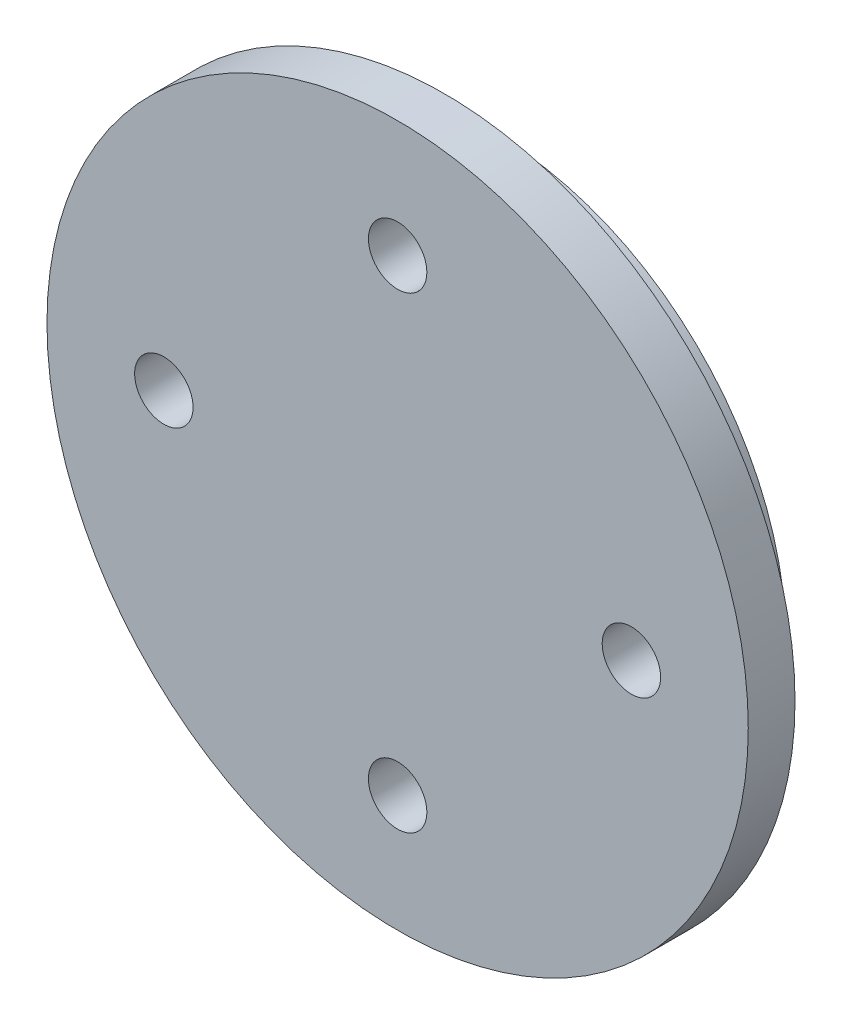
ISO-10303-21;
HEADER;
FILE_DESCRIPTION(('STEP AP214'),'2;1');
FILE_NAME('part.step','',(''),(''),'','','');
FILE_SCHEMA(('AUTOMOTIVE_DESIGN { 1 0 10303 214 1 1 1 1 }'));
ENDSEC;
DATA;
#1=APPLICATION_CONTEXT('core data for automotive mechanical design processes');
#2=APPLICATION_PROTOCOL_DEFINITION('international standard','automotive_design',2000,#1);
#3=PRODUCT_CONTEXT('',#1,'mechanical');
#4=PRODUCT('Part','Part','',(#3));
#5=PRODUCT_RELATED_PRODUCT_CATEGORY('part','',(#4));
#6=PRODUCT_DEFINITION_FORMATION('','',#4);
#7=PRODUCT_DEFINITION_CONTEXT('part definition',#1,'design');
#8=PRODUCT_DEFINITION('design','',#6,#7);
#9=PRODUCT_DEFINITION_SHAPE('','',#8);
#10=(LENGTH_UNIT() NAMED_UNIT(*) SI_UNIT(.MILLI.,.METRE.));
#11=(NAMED_UNIT(*) PLANE_ANGLE_UNIT() SI_UNIT($,.RADIAN.));
#12=(NAMED_UNIT(*) SI_UNIT($,.STERADIAN.) SOLID_ANGLE_UNIT());
#13=UNCERTAINTY_MEASURE_WITH_UNIT(LENGTH_MEASURE(1.E-05),#10,'distance_accuracy_value','');
#14=(GEOMETRIC_REPRESENTATION_CONTEXT(3) GLOBAL_UNCERTAINTY_ASSIGNED_CONTEXT((#13)) GLOBAL_UNIT_ASSIGNED_CONTEXT((#10,
#11,#12)) REPRESENTATION_CONTEXT('',''));
#15=CARTESIAN_POINT('',(0.,0.,0.));
#16=DIRECTION('',(0.,0.,1.));
#17=DIRECTION('',(1.,0.,0.));
#18=AXIS2_PLACEMENT_3D('',#15,#16,#17);
#19=CARTESIAN_POINT('',(0.,0.,5.334));
#20=DIRECTION('',(0.,0.,-1.));
#21=DIRECTION('',(-1.,0.,0.));
#22=AXIS2_PLACEMENT_3D('',#19,#20,#21);
#23=CYLINDRICAL_SURFACE('',#22,31.75);
#24=CARTESIAN_POINT('',(0.,0.,5.334));
#25=DIRECTION('',(0.,0.,1.));
#26=DIRECTION('',(1.,0.,0.));
#27=AXIS2_PLACEMENT_3D('',#24,#25,#26);
#28=CIRCLE('',#27,31.75);
#29=CARTESIAN_POINT('',(31.75,0.,5.334));
#30=VERTEX_POINT('',#29);
#31=EDGE_CURVE('E10',#30,#30,#28,.T.);
#32=ORIENTED_EDGE('',*,*,#31,.F.);
#33=EDGE_LOOP('',(#32));
#34=FACE_BOUND('',#33,.T.);
#35=CARTESIAN_POINT('',(0.,0.,0.));
#36=DIRECTION('',(0.,0.,1.));
#37=DIRECTION('',(1.,0.,0.));
#38=AXIS2_PLACEMENT_3D('',#35,#36,#37);
#39=CIRCLE('',#38,31.75);
#40=CARTESIAN_POINT('',(31.75,0.,0.));
#41=VERTEX_POINT('',#40);
#42=EDGE_CURVE('E39',#41,#41,#39,.T.);
#43=ORIENTED_EDGE('',*,*,#42,.T.);
#44=EDGE_LOOP('',(#43));
#45=FACE_BOUND('',#44,.T.);
#46=ADVANCED_FACE('F36',(#34,#45),#23,.T.);
#47=CARTESIAN_POINT('',(0.,0.,0.));
#48=DIRECTION('',(0.,0.,1.));
#49=DIRECTION('',(1.,0.,0.));
#50=AXIS2_PLACEMENT_3D('',#47,#48,#49);
#51=PLANE('',#50);
#52=CARTESIAN_POINT('',(0.,5.08,0.));
#53=DIRECTION('',(0.,0.,-1.));
#54=DIRECTION('',(0.,-1.,0.));
#55=AXIS2_PLACEMENT_3D('',#52,#53,#54);
#56=CIRCLE('',#55,1.27);
#57=CARTESIAN_POINT('',(0.,3.81,0.));
#58=VERTEX_POINT('',#57);
#59=EDGE_CURVE('E111',#58,#58,#56,.T.);
#60=ORIENTED_EDGE('',*,*,#59,.F.);
#61=EDGE_LOOP('',(#60));
#62=FACE_BOUND('',#61,.T.);
#63=CARTESIAN_POINT('',(-5.08,0.,0.));
#64=DIRECTION('',(0.,0.,-1.));
#65=DIRECTION('',(1.,0.,0.));
#66=AXIS2_PLACEMENT_3D('',#63,#64,#65);
#67=CIRCLE('',#66,1.27);
#68=CARTESIAN_POINT('',(-3.81,0.,0.));
#69=VERTEX_POINT('',#68);
#70=EDGE_CURVE('E102',#69,#69,#67,.T.);
#71=ORIENTED_EDGE('',*,*,#70,.F.);
#72=EDGE_LOOP('',(#71));
#73=FACE_BOUND('',#72,.T.);
#74=CARTESIAN_POINT('',(0.,-5.08,0.));
#75=DIRECTION('',(0.,0.,-1.));
#76=DIRECTION('',(0.,1.,0.));
#77=AXIS2_PLACEMENT_3D('',#74,#75,#76);
#78=CIRCLE('',#77,1.27);
#79=CARTESIAN_POINT('',(0.,-3.81,0.));
#80=VERTEX_POINT('',#79);
#81=EDGE_CURVE('E103',#80,#80,#78,.T.);
#82=ORIENTED_EDGE('',*,*,#81,.F.);
#83=EDGE_LOOP('',(#82));
#84=FACE_BOUND('',#83,.T.);
#85=CARTESIAN_POINT('',(5.08,0.,0.));
#86=DIRECTION('',(0.,0.,-1.));
#87=DIRECTION('',(-1.,0.,0.));
#88=AXIS2_PLACEMENT_3D('',#85,#86,#87);
#89=CIRCLE('',#88,1.27);
#90=CARTESIAN_POINT('',(3.81,0.,0.));
#91=VERTEX_POINT('',#90);
#92=EDGE_CURVE('E93',#91,#91,#89,.T.);
#93=ORIENTED_EDGE('',*,*,#92,.F.);
#94=EDGE_LOOP('',(#93));
#95=FACE_BOUND('',#94,.T.);
#96=CARTESIAN_POINT('',(-25.4,0.,0.));
#97=DIRECTION('',(0.,0.,1.));
#98=DIRECTION('',(0.,1.,0.));
#99=AXIS2_PLACEMENT_3D('',#96,#97,#98);
#100=CIRCLE('',#99,3.175);
#101=CARTESIAN_POINT('',(-25.4,3.17499999999991,0.));
#102=VERTEX_POINT('',#101);
#103=EDGE_CURVE('E62',#102,#102,#100,.T.);
#104=ORIENTED_EDGE('',*,*,#103,.T.);
#105=EDGE_LOOP('',(#104));
#106=FACE_BOUND('',#105,.T.);
#107=CARTESIAN_POINT('',(0.,-25.4,0.));
#108=DIRECTION('',(0.,0.,1.));
#109=DIRECTION('',(-1.,0.,0.));
#110=AXIS2_PLACEMENT_3D('',#107,#108,#109);
#111=CIRCLE('',#110,3.175);
#112=CARTESIAN_POINT('',(-3.175,-25.4,0.));
#113=VERTEX_POINT('',#112);
#114=EDGE_CURVE('E79',#113,#113,#111,.T.);
#115=ORIENTED_EDGE('',*,*,#114,.T.);
#116=EDGE_LOOP('',(#115));
#117=FACE_BOUND('',#116,.T.);
#118=CARTESIAN_POINT('',(25.4,2.66050878019847E-13,0.));
#119=DIRECTION('',(0.,0.,1.));
#120=DIRECTION('',(0.,-1.,0.));
#121=AXIS2_PLACEMENT_3D('',#118,#119,#120);
#122=CIRCLE('',#121,3.175);
#123=CARTESIAN_POINT('',(25.4,-3.17499999999973,0.));
#124=VERTEX_POINT('',#123);
#125=EDGE_CURVE('E70',#124,#124,#122,.T.);
#126=ORIENTED_EDGE('',*,*,#125,.T.);
#127=EDGE_LOOP('',(#126));
#128=FACE_BOUND('',#127,.T.);
#129=CARTESIAN_POINT('',(0.,25.4,0.));
#130=DIRECTION('',(0.,0.,1.));
#131=DIRECTION('',(1.,0.,0.));
#132=AXIS2_PLACEMENT_3D('',#129,#130,#131);
#133=CIRCLE('',#132,3.175);
#134=CARTESIAN_POINT('',(3.175,25.4,0.));
#135=VERTEX_POINT('',#134);
#136=EDGE_CURVE('E54',#135,#135,#133,.T.);
#137=ORIENTED_EDGE('',*,*,#136,.T.);
#138=EDGE_LOOP('',(#137));
#139=FACE_BOUND('',#138,.T.);
#140=ORIENTED_EDGE('',*,*,#42,.F.);
#141=EDGE_LOOP('',(#140));
#142=FACE_BOUND('',#141,.T.);
#143=ADVANCED_FACE('F125',(#62,#73,#84,#95,#106,#117,#128,#139,#142),#51,.F.);
#144=CARTESIAN_POINT('',(0.,0.,10.414));
#145=DIRECTION('',(0.,0.,-1.));
#146=DIRECTION('',(-1.,0.,0.));
#147=AXIS2_PLACEMENT_3D('',#144,#145,#146);
#148=CYLINDRICAL_SURFACE('',#147,38.1);
#149=CARTESIAN_POINT('',(0.,0.,10.414));
#150=DIRECTION('',(0.,0.,1.));
#151=DIRECTION('',(1.,0.,0.));
#152=AXIS2_PLACEMENT_3D('',#149,#150,#151);
#153=CIRCLE('',#152,38.1);
#154=CARTESIAN_POINT('',(38.1,0.,10.414));
#155=VERTEX_POINT('',#154);
#156=EDGE_CURVE('E48',#155,#155,#153,.T.);
#157=ORIENTED_EDGE('',*,*,#156,.F.);
#158=EDGE_LOOP('',(#157));
#159=FACE_BOUND('',#158,.T.);
#160=CARTESIAN_POINT('',(0.,0.,5.334));
#161=DIRECTION('',(0.,0.,1.));
#162=DIRECTION('',(1.,0.,0.));
#163=AXIS2_PLACEMENT_3D('',#160,#161,#162);
#164=CIRCLE('',#163,38.1);
#165=CARTESIAN_POINT('',(38.1,0.,5.334));
#166=VERTEX_POINT('',#165);
#167=EDGE_CURVE('E50',#166,#166,#164,.T.);
#168=ORIENTED_EDGE('',*,*,#167,.T.);
#169=EDGE_LOOP('',(#168));
#170=FACE_BOUND('',#169,.T.);
#171=ADVANCED_FACE('F128',(#159,#170),#148,.T.);
#172=CARTESIAN_POINT('',(0.,0.,10.414));
#173=DIRECTION('',(0.,0.,1.));
#174=DIRECTION('',(1.,0.,0.));
#175=AXIS2_PLACEMENT_3D('',#172,#173,#174);
#176=PLANE('',#175);
#177=CARTESIAN_POINT('',(-25.4,0.,10.414));
#178=DIRECTION('',(0.,0.,1.));
#179=DIRECTION('',(0.,1.,0.));
#180=AXIS2_PLACEMENT_3D('',#177,#178,#179);
#181=CIRCLE('',#180,3.175);
#182=CARTESIAN_POINT('',(-25.4,3.17499999999991,10.414));
#183=VERTEX_POINT('',#182);
#184=EDGE_CURVE('E83',#183,#183,#181,.T.);
#185=ORIENTED_EDGE('',*,*,#184,.F.);
#186=EDGE_LOOP('',(#185));
#187=FACE_BOUND('',#186,.T.);
#188=CARTESIAN_POINT('',(0.,-25.4,10.414));
#189=DIRECTION('',(0.,0.,1.));
#190=DIRECTION('',(-1.,0.,0.));
#191=AXIS2_PLACEMENT_3D('',#188,#189,#190);
#192=CIRCLE('',#191,3.175);
#193=CARTESIAN_POINT('',(-3.175,-25.4,10.414));
#194=VERTEX_POINT('',#193);
#195=EDGE_CURVE('E75',#194,#194,#192,.T.);
#196=ORIENTED_EDGE('',*,*,#195,.F.);
#197=EDGE_LOOP('',(#196));
#198=FACE_BOUND('',#197,.T.);
#199=CARTESIAN_POINT('',(25.4,2.66050878019847E-13,10.414));
#200=DIRECTION('',(0.,0.,1.));
#201=DIRECTION('',(0.,-1.,0.));
#202=AXIS2_PLACEMENT_3D('',#199,#200,#201);
#203=CIRCLE('',#202,3.175);
#204=CARTESIAN_POINT('',(25.4,-3.17499999999973,10.414));
#205=VERTEX_POINT('',#204);
#206=EDGE_CURVE('E66',#205,#205,#203,.T.);
#207=ORIENTED_EDGE('',*,*,#206,.F.);
#208=EDGE_LOOP('',(#207));
#209=FACE_BOUND('',#208,.T.);
#210=CARTESIAN_POINT('',(0.,25.4,10.414));
#211=DIRECTION('',(0.,0.,1.));
#212=DIRECTION('',(1.,0.,0.));
#213=AXIS2_PLACEMENT_3D('',#210,#211,#212);
#214=CIRCLE('',#213,3.175);
#215=CARTESIAN_POINT('',(3.175,25.4,10.414));
#216=VERTEX_POINT('',#215);
#217=EDGE_CURVE('E58',#216,#216,#214,.T.);
#218=ORIENTED_EDGE('',*,*,#217,.F.);
#219=EDGE_LOOP('',(#218));
#220=FACE_BOUND('',#219,.T.);
#221=ORIENTED_EDGE('',*,*,#156,.T.);
#222=EDGE_LOOP('',(#221));
#223=FACE_BOUND('',#222,.T.);
#224=ADVANCED_FACE('F164',(#187,#198,#209,#220,#223),#176,.T.);
#225=CARTESIAN_POINT('',(0.,0.,5.334));
#226=DIRECTION('',(0.,0.,1.));
#227=DIRECTION('',(1.,0.,0.));
#228=AXIS2_PLACEMENT_3D('',#225,#226,#227);
#229=PLANE('',#228);
#230=ORIENTED_EDGE('',*,*,#31,.T.);
#231=EDGE_LOOP('',(#230));
#232=FACE_BOUND('',#231,.T.);
#233=ORIENTED_EDGE('',*,*,#167,.F.);
#234=EDGE_LOOP('',(#233));
#235=FACE_BOUND('',#234,.T.);
#236=ADVANCED_FACE('F173',(#232,#235),#229,.F.);
#237=CARTESIAN_POINT('',(0.,25.4,0.));
#238=DIRECTION('',(0.,0.,1.));
#239=DIRECTION('',(1.,0.,0.));
#240=AXIS2_PLACEMENT_3D('',#237,#238,#239);
#241=CYLINDRICAL_SURFACE('',#240,3.175);
#242=ORIENTED_EDGE('',*,*,#136,.F.);
#243=EDGE_LOOP('',(#242));
#244=FACE_BOUND('',#243,.T.);
#245=ORIENTED_EDGE('',*,*,#217,.T.);
#246=EDGE_LOOP('',(#245));
#247=FACE_BOUND('',#246,.T.);
#248=ADVANCED_FACE('F184',(#244,#247),#241,.F.);
#249=CARTESIAN_POINT('',(25.4,2.66050878019847E-13,0.));
#250=DIRECTION('',(0.,0.,1.));
#251=DIRECTION('',(1.,0.,0.));
#252=AXIS2_PLACEMENT_3D('',#249,#250,#251);
#253=CYLINDRICAL_SURFACE('',#252,3.175);
#254=ORIENTED_EDGE('',*,*,#125,.F.);
#255=EDGE_LOOP('',(#254));
#256=FACE_BOUND('',#255,.T.);
#257=ORIENTED_EDGE('',*,*,#206,.T.);
#258=EDGE_LOOP('',(#257));
#259=FACE_BOUND('',#258,.T.);
#260=ADVANCED_FACE('F189',(#256,#259),#253,.F.);
#261=CARTESIAN_POINT('',(0.,-25.4,0.));
#262=DIRECTION('',(0.,0.,1.));
#263=DIRECTION('',(1.,0.,0.));
#264=AXIS2_PLACEMENT_3D('',#261,#262,#263);
#265=CYLINDRICAL_SURFACE('',#264,3.175);
#266=ORIENTED_EDGE('',*,*,#114,.F.);
#267=EDGE_LOOP('',(#266));
#268=FACE_BOUND('',#267,.T.);
#269=ORIENTED_EDGE('',*,*,#195,.T.);
#270=EDGE_LOOP('',(#269));
#271=FACE_BOUND('',#270,.T.);
#272=ADVANCED_FACE('F196',(#268,#271),#265,.F.);
#273=CARTESIAN_POINT('',(-25.4,0.,0.));
#274=DIRECTION('',(0.,0.,1.));
#275=DIRECTION('',(1.,0.,0.));
#276=AXIS2_PLACEMENT_3D('',#273,#274,#275);
#277=CYLINDRICAL_SURFACE('',#276,3.175);
#278=ORIENTED_EDGE('',*,*,#103,.F.);
#279=EDGE_LOOP('',(#278));
#280=FACE_BOUND('',#279,.T.);
#281=ORIENTED_EDGE('',*,*,#184,.T.);
#282=EDGE_LOOP('',(#281));
#283=FACE_BOUND('',#282,.T.);
#284=ADVANCED_FACE('F204',(#280,#283),#277,.F.);
#285=CARTESIAN_POINT('',(0.,0.,5.334));
#286=DIRECTION('',(0.,0.,1.));
#287=DIRECTION('',(1.,0.,0.));
#288=AXIS2_PLACEMENT_3D('',#285,#286,#287);
#289=PLANE('',#288);
#290=CARTESIAN_POINT('',(5.08,0.,5.334));
#291=DIRECTION('',(0.,0.,1.));
#292=DIRECTION('',(1.,0.,0.));
#293=AXIS2_PLACEMENT_3D('',#290,#291,#292);
#294=CIRCLE('',#293,1.27);
#295=CARTESIAN_POINT('',(6.35,0.,5.334));
#296=VERTEX_POINT('',#295);
#297=EDGE_CURVE('E71',#296,#296,#294,.F.);
#298=ORIENTED_EDGE('',*,*,#297,.T.);
#299=EDGE_LOOP('',(#298));
#300=FACE_BOUND('',#299,.T.);
#301=ADVANCED_FACE('F212',(#300),#289,.F.);
#302=CARTESIAN_POINT('',(5.08,0.,8.92610244842766));
#303=DIRECTION('',(0.,0.,-1.));
#304=DIRECTION('',(-1.,0.,0.));
#305=AXIS2_PLACEMENT_3D('',#302,#303,#304);
#306=CYLINDRICAL_SURFACE('',#305,1.27);
#307=ORIENTED_EDGE('',*,*,#92,.T.);
#308=EDGE_LOOP('',(#307));
#309=FACE_BOUND('',#308,.T.);
#310=ORIENTED_EDGE('',*,*,#297,.F.);
#311=EDGE_LOOP('',(#310));
#312=FACE_BOUND('',#311,.T.);
#313=ADVANCED_FACE('F220',(#309,#312),#306,.F.);
#314=CARTESIAN_POINT('',(0.,0.,5.334));
#315=DIRECTION('',(0.,0.,1.));
#316=DIRECTION('',(1.,0.,0.));
#317=AXIS2_PLACEMENT_3D('',#314,#315,#316);
#318=PLANE('',#317);
#319=CARTESIAN_POINT('',(0.,-5.08,5.334));
#320=DIRECTION('',(0.,0.,1.));
#321=DIRECTION('',(1.,0.,0.));
#322=AXIS2_PLACEMENT_3D('',#319,#320,#321);
#323=CIRCLE('',#322,1.27);
#324=CARTESIAN_POINT('',(1.27000000000005,-5.08,5.334));
#325=VERTEX_POINT('',#324);
#326=EDGE_CURVE('E98',#325,#325,#323,.F.);
#327=ORIENTED_EDGE('',*,*,#326,.T.);
#328=EDGE_LOOP('',(#327));
#329=FACE_BOUND('',#328,.T.);
#330=ADVANCED_FACE('F227',(#329),#318,.F.);
#331=CARTESIAN_POINT('',(0.,-5.08,8.92610244842766));
#332=DIRECTION('',(0.,0.,-1.));
#333=DIRECTION('',(-1.,0.,0.));
#334=AXIS2_PLACEMENT_3D('',#331,#332,#333);
#335=CYLINDRICAL_SURFACE('',#334,1.27);
#336=ORIENTED_EDGE('',*,*,#81,.T.);
#337=EDGE_LOOP('',(#336));
#338=FACE_BOUND('',#337,.T.);
#339=ORIENTED_EDGE('',*,*,#326,.F.);
#340=EDGE_LOOP('',(#339));
#341=FACE_BOUND('',#340,.T.);
#342=ADVANCED_FACE('F234',(#338,#341),#335,.F.);
#343=CARTESIAN_POINT('',(0.,0.,5.334));
#344=DIRECTION('',(0.,0.,1.));
#345=DIRECTION('',(1.,0.,0.));
#346=AXIS2_PLACEMENT_3D('',#343,#344,#345);
#347=PLANE('',#346);
#348=CARTESIAN_POINT('',(-5.08,0.,5.334));
#349=DIRECTION('',(0.,0.,1.));
#350=DIRECTION('',(1.,0.,0.));
#351=AXIS2_PLACEMENT_3D('',#348,#349,#350);
#352=CIRCLE('',#351,1.27);
#353=CARTESIAN_POINT('',(-3.81,0.,5.334));
#354=VERTEX_POINT('',#353);
#355=EDGE_CURVE('E107',#354,#354,#352,.F.);
#356=ORIENTED_EDGE('',*,*,#355,.T.);
#357=EDGE_LOOP('',(#356));
#358=FACE_BOUND('',#357,.T.);
#359=ADVANCED_FACE('F242',(#358),#347,.F.);
#360=CARTESIAN_POINT('',(-5.08,0.,8.92610244842766));
#361=DIRECTION('',(0.,0.,-1.));
#362=DIRECTION('',(-1.,0.,0.));
#363=AXIS2_PLACEMENT_3D('',#360,#361,#362);
#364=CYLINDRICAL_SURFACE('',#363,1.27);
#365=ORIENTED_EDGE('',*,*,#70,.T.);
#366=EDGE_LOOP('',(#365));
#367=FACE_BOUND('',#366,.T.);
#368=ORIENTED_EDGE('',*,*,#355,.F.);
#369=EDGE_LOOP('',(#368));
#370=FACE_BOUND('',#369,.T.);
#371=ADVANCED_FACE('F250',(#367,#370),#364,.F.);
#372=CARTESIAN_POINT('',(0.,0.,5.334));
#373=DIRECTION('',(0.,0.,1.));
#374=DIRECTION('',(1.,0.,0.));
#375=AXIS2_PLACEMENT_3D('',#372,#373,#374);
#376=PLANE('',#375);
#377=CARTESIAN_POINT('',(0.,5.08,5.334));
#378=DIRECTION('',(0.,0.,1.));
#379=DIRECTION('',(1.,0.,0.));
#380=AXIS2_PLACEMENT_3D('',#377,#378,#379);
#381=CIRCLE('',#380,1.27);
#382=CARTESIAN_POINT('',(1.26999999999998,5.08,5.334));
#383=VERTEX_POINT('',#382);
#384=EDGE_CURVE('E97',#383,#383,#381,.F.);
#385=ORIENTED_EDGE('',*,*,#384,.T.);
#386=EDGE_LOOP('',(#385));
#387=FACE_BOUND('',#386,.T.);
#388=ADVANCED_FACE('F258',(#387),#376,.F.);
#389=CARTESIAN_POINT('',(0.,5.08,8.92610244842766));
#390=DIRECTION('',(0.,0.,-1.));
#391=DIRECTION('',(-1.,0.,0.));
#392=AXIS2_PLACEMENT_3D('',#389,#390,#391);
#393=CYLINDRICAL_SURFACE('',#392,1.27);
#394=ORIENTED_EDGE('',*,*,#59,.T.);
#395=EDGE_LOOP('',(#394));
#396=FACE_BOUND('',#395,.T.);
#397=ORIENTED_EDGE('',*,*,#384,.F.);
#398=EDGE_LOOP('',(#397));
#399=FACE_BOUND('',#398,.T.);
#400=ADVANCED_FACE('F122',(#396,#399),#393,.F.);
#401=CLOSED_SHELL('',(#46,#143,#171,#224,#236,#248,#260,#272,#284,#301,#313,#330,#342,#359,#371,
#388,#400));
#402=MANIFOLD_SOLID_BREP('B2',#401);
#403=ADVANCED_BREP_SHAPE_REPRESENTATION('',(#18,#402),#14);
#404=SHAPE_DEFINITION_REPRESENTATION(#9,#403);
ENDSEC;
END-ISO-10303-21;
